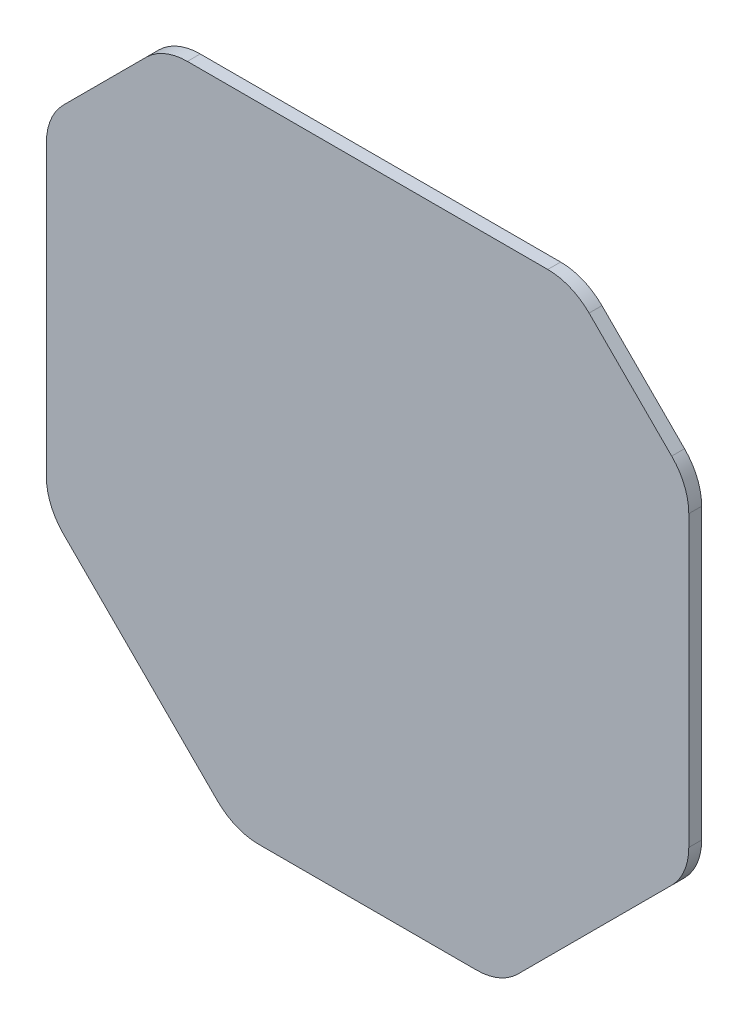
ISO-10303-21;
HEADER;
FILE_DESCRIPTION(('STEP AP214'),'2;1');
FILE_NAME('part.step','',(''),(''),'','','');
FILE_SCHEMA(('AUTOMOTIVE_DESIGN { 1 0 10303 214 1 1 1 1 }'));
ENDSEC;
DATA;
#1=APPLICATION_CONTEXT('core data for automotive mechanical design processes');
#2=APPLICATION_PROTOCOL_DEFINITION('international standard','automotive_design',2000,#1);
#3=PRODUCT_CONTEXT('',#1,'mechanical');
#4=PRODUCT('Part','Part','',(#3));
#5=PRODUCT_RELATED_PRODUCT_CATEGORY('part','',(#4));
#6=PRODUCT_DEFINITION_FORMATION('','',#4);
#7=PRODUCT_DEFINITION_CONTEXT('part definition',#1,'design');
#8=PRODUCT_DEFINITION('design','',#6,#7);
#9=PRODUCT_DEFINITION_SHAPE('','',#8);
#10=(LENGTH_UNIT() NAMED_UNIT(*) SI_UNIT(.MILLI.,.METRE.));
#11=(NAMED_UNIT(*) PLANE_ANGLE_UNIT() SI_UNIT($,.RADIAN.));
#12=(NAMED_UNIT(*) SI_UNIT($,.STERADIAN.) SOLID_ANGLE_UNIT());
#13=UNCERTAINTY_MEASURE_WITH_UNIT(LENGTH_MEASURE(1.E-05),#10,'distance_accuracy_value','');
#14=(GEOMETRIC_REPRESENTATION_CONTEXT(3) GLOBAL_UNCERTAINTY_ASSIGNED_CONTEXT((#13)) GLOBAL_UNIT_ASSIGNED_CONTEXT((#10,
#11,#12)) REPRESENTATION_CONTEXT('',''));
#15=CARTESIAN_POINT('',(0.,0.,0.));
#16=DIRECTION('',(0.,0.,1.));
#17=DIRECTION('',(1.,0.,0.));
#18=AXIS2_PLACEMENT_3D('',#15,#16,#17);
#19=CARTESIAN_POINT('',(114.3,-47.3446101792446,5.588));
#20=DIRECTION('',(0.,0.,-1.));
#21=DIRECTION('',(-1.,0.,0.));
#22=AXIS2_PLACEMENT_3D('',#19,#20,#21);
#23=CYLINDRICAL_SURFACE('',#22,25.4);
#24=CARTESIAN_POINT('',(114.3,-47.3446101792446,0.));
#25=DIRECTION('',(0.,0.,1.));
#26=DIRECTION('',(-1.,0.,0.));
#27=AXIS2_PLACEMENT_3D('',#24,#25,#26);
#28=CIRCLE('',#27,25.4);
#29=CARTESIAN_POINT('',(132.260512242138,-65.3051224213828,0.));
#30=VERTEX_POINT('',#29);
#31=CARTESIAN_POINT('',(139.7,-47.3446101792445,0.));
#32=VERTEX_POINT('',#31);
#33=EDGE_CURVE('E177',#30,#32,#28,.T.);
#34=ORIENTED_EDGE('',*,*,#33,.T.);
#35=DIRECTION('',(0.,0.,-1.));
#36=VECTOR('',#35,1.);
#37=CARTESIAN_POINT('',(139.7,-47.3446101792445,5.588));
#38=LINE('',#37,#36);
#39=CARTESIAN_POINT('',(139.7,-47.3446101792445,5.588));
#40=VERTEX_POINT('',#39);
#41=EDGE_CURVE('E11',#40,#32,#38,.T.);
#42=ORIENTED_EDGE('',*,*,#41,.F.);
#43=CARTESIAN_POINT('',(114.3,-47.3446101792446,5.588));
#44=DIRECTION('',(0.,0.,1.));
#45=DIRECTION('',(-1.,0.,0.));
#46=AXIS2_PLACEMENT_3D('',#43,#44,#45);
#47=CIRCLE('',#46,25.4);
#48=CARTESIAN_POINT('',(132.260512242138,-65.3051224213828,5.588));
#49=VERTEX_POINT('',#48);
#50=EDGE_CURVE('E207',#49,#40,#47,.T.);
#51=ORIENTED_EDGE('',*,*,#50,.F.);
#52=DIRECTION('',(0.,0.,-1.));
#53=VECTOR('',#52,1.);
#54=CARTESIAN_POINT('',(132.260512242138,-65.3051224213828,5.588));
#55=LINE('',#54,#53);
#56=EDGE_CURVE('E173',#49,#30,#55,.T.);
#57=ORIENTED_EDGE('',*,*,#56,.T.);
#58=EDGE_LOOP('',(#34,#42,#51,#57));
#59=FACE_BOUND('',#58,.T.);
#60=ADVANCED_FACE('F33',(#59),#23,.T.);
#61=CARTESIAN_POINT('',(139.7,78.3789755157245,5.588));
#62=DIRECTION('',(-1.,0.,0.));
#63=DIRECTION('',(0.,-1.,0.));
#64=AXIS2_PLACEMENT_3D('',#61,#62,#63);
#65=PLANE('',#64);
#66=DIRECTION('',(0.,1.,0.));
#67=VECTOR('',#66,1.);
#68=CARTESIAN_POINT('',(139.7,78.3789755157245,0.));
#69=LINE('',#68,#67);
#70=CARTESIAN_POINT('',(139.7,78.3789755157245,0.));
#71=VERTEX_POINT('',#70);
#72=EDGE_CURVE('E180',#32,#71,#69,.T.);
#73=ORIENTED_EDGE('',*,*,#72,.T.);
#74=DIRECTION('',(0.,0.,-1.));
#75=VECTOR('',#74,1.);
#76=CARTESIAN_POINT('',(139.7,78.3789755157245,5.588));
#77=LINE('',#76,#75);
#78=CARTESIAN_POINT('',(139.7,78.3789755157245,5.588));
#79=VERTEX_POINT('',#78);
#80=EDGE_CURVE('E41',#79,#71,#77,.T.);
#81=ORIENTED_EDGE('',*,*,#80,.F.);
#82=DIRECTION('',(0.,1.,0.));
#83=VECTOR('',#82,1.);
#84=CARTESIAN_POINT('',(139.7,78.3789755157245,5.588));
#85=LINE('',#84,#83);
#86=EDGE_CURVE('E116',#40,#79,#85,.T.);
#87=ORIENTED_EDGE('',*,*,#86,.F.);
#88=ORIENTED_EDGE('',*,*,#41,.T.);
#89=EDGE_LOOP('',(#73,#81,#87,#88));
#90=FACE_BOUND('',#89,.T.);
#91=ADVANCED_FACE('F305',(#90),#65,.F.);
#92=CARTESIAN_POINT('',(114.3,78.3789755157245,5.588));
#93=DIRECTION('',(0.,0.,-1.));
#94=DIRECTION('',(-1.,0.,0.));
#95=AXIS2_PLACEMENT_3D('',#92,#93,#94);
#96=CYLINDRICAL_SURFACE('',#95,25.4);
#97=CARTESIAN_POINT('',(114.3,78.3789755157245,0.));
#98=DIRECTION('',(0.,0.,1.));
#99=DIRECTION('',(1.,0.,0.));
#100=AXIS2_PLACEMENT_3D('',#97,#98,#99);
#101=CIRCLE('',#100,25.4);
#102=CARTESIAN_POINT('',(132.260512242138,96.3394877578631,0.));
#103=VERTEX_POINT('',#102);
#104=EDGE_CURVE('E182',#71,#103,#101,.T.);
#105=ORIENTED_EDGE('',*,*,#104,.T.);
#106=DIRECTION('',(0.,0.,-1.));
#107=VECTOR('',#106,1.);
#108=CARTESIAN_POINT('',(132.260512242138,96.3394877578631,5.588));
#109=LINE('',#108,#107);
#110=CARTESIAN_POINT('',(132.260512242138,96.3394877578631,5.588));
#111=VERTEX_POINT('',#110);
#112=EDGE_CURVE('E238',#111,#103,#109,.T.);
#113=ORIENTED_EDGE('',*,*,#112,.F.);
#114=CARTESIAN_POINT('',(114.3,78.3789755157245,5.588));
#115=DIRECTION('',(0.,0.,1.));
#116=DIRECTION('',(1.,0.,0.));
#117=AXIS2_PLACEMENT_3D('',#114,#115,#116);
#118=CIRCLE('',#117,25.4);
#119=EDGE_CURVE('E246',#79,#111,#118,.T.);
#120=ORIENTED_EDGE('',*,*,#119,.F.);
#121=ORIENTED_EDGE('',*,*,#80,.T.);
#122=EDGE_LOOP('',(#105,#113,#120,#121));
#123=FACE_BOUND('',#122,.T.);
#124=ADVANCED_FACE('F244',(#123),#96,.T.);
#125=CARTESIAN_POINT('',(96.3394877578616,132.260512242139,5.588));
#126=DIRECTION('',(-0.707106781186538,-0.707106781186557,0.));
#127=DIRECTION('',(0.707106781186557,-0.707106781186538,0.));
#128=AXIS2_PLACEMENT_3D('',#125,#126,#127);
#129=PLANE('',#128);
#130=DIRECTION('',(-0.707106781186557,0.707106781186538,0.));
#131=VECTOR('',#130,1.);
#132=CARTESIAN_POINT('',(96.3394877578616,132.260512242139,0.));
#133=LINE('',#132,#131);
#134=CARTESIAN_POINT('',(96.3394877578616,132.260512242139,0.));
#135=VERTEX_POINT('',#134);
#136=EDGE_CURVE('E184',#103,#135,#133,.T.);
#137=ORIENTED_EDGE('',*,*,#136,.T.);
#138=DIRECTION('',(0.,0.,-1.));
#139=VECTOR('',#138,1.);
#140=CARTESIAN_POINT('',(96.3394877578616,132.260512242139,5.588));
#141=LINE('',#140,#139);
#142=CARTESIAN_POINT('',(96.3394877578616,132.260512242139,5.588));
#143=VERTEX_POINT('',#142);
#144=EDGE_CURVE('E235',#143,#135,#141,.T.);
#145=ORIENTED_EDGE('',*,*,#144,.F.);
#146=DIRECTION('',(-0.707106781186557,0.707106781186538,0.));
#147=VECTOR('',#146,1.);
#148=CARTESIAN_POINT('',(96.3394877578616,132.260512242139,5.588));
#149=LINE('',#148,#147);
#150=EDGE_CURVE('E264',#111,#143,#149,.T.);
#151=ORIENTED_EDGE('',*,*,#150,.F.);
#152=ORIENTED_EDGE('',*,*,#112,.T.);
#153=EDGE_LOOP('',(#137,#145,#151,#152));
#154=FACE_BOUND('',#153,.T.);
#155=ADVANCED_FACE('F255',(#154),#129,.F.);
#156=CARTESIAN_POINT('',(78.3789755157236,114.3,5.588));
#157=DIRECTION('',(0.,0.,-1.));
#158=DIRECTION('',(-1.,0.,0.));
#159=AXIS2_PLACEMENT_3D('',#156,#157,#158);
#160=CYLINDRICAL_SURFACE('',#159,25.4);
#161=CARTESIAN_POINT('',(78.3789755157236,114.3,0.));
#162=DIRECTION('',(0.,0.,1.));
#163=DIRECTION('',(1.,0.,0.));
#164=AXIS2_PLACEMENT_3D('',#161,#162,#163);
#165=CIRCLE('',#164,25.4);
#166=CARTESIAN_POINT('',(78.3789755157236,139.7,0.));
#167=VERTEX_POINT('',#166);
#168=EDGE_CURVE('E186',#135,#167,#165,.T.);
#169=ORIENTED_EDGE('',*,*,#168,.T.);
#170=DIRECTION('',(0.,0.,-1.));
#171=VECTOR('',#170,1.);
#172=CARTESIAN_POINT('',(78.3789755157236,139.7,5.588));
#173=LINE('',#172,#171);
#174=CARTESIAN_POINT('',(78.3789755157236,139.7,5.588));
#175=VERTEX_POINT('',#174);
#176=EDGE_CURVE('E232',#175,#167,#173,.T.);
#177=ORIENTED_EDGE('',*,*,#176,.F.);
#178=CARTESIAN_POINT('',(78.3789755157236,114.3,5.588));
#179=DIRECTION('',(0.,0.,1.));
#180=DIRECTION('',(1.,0.,0.));
#181=AXIS2_PLACEMENT_3D('',#178,#179,#180);
#182=CIRCLE('',#181,25.4);
#183=EDGE_CURVE('E261',#143,#175,#182,.T.);
#184=ORIENTED_EDGE('',*,*,#183,.F.);
#185=ORIENTED_EDGE('',*,*,#144,.T.);
#186=EDGE_LOOP('',(#169,#177,#184,#185));
#187=FACE_BOUND('',#186,.T.);
#188=ADVANCED_FACE('F259',(#187),#160,.T.);
#189=CARTESIAN_POINT('',(78.3789755157236,139.7,5.588));
#190=DIRECTION('',(0.,-1.,0.));
#191=DIRECTION('',(1.,0.,0.));
#192=AXIS2_PLACEMENT_3D('',#189,#190,#191);
#193=PLANE('',#192);
#194=DIRECTION('',(-1.,0.,0.));
#195=VECTOR('',#194,1.);
#196=CARTESIAN_POINT('',(78.3789755157236,139.7,0.));
#197=LINE('',#196,#195);
#198=CARTESIAN_POINT('',(-78.3789755157232,139.7,0.));
#199=VERTEX_POINT('',#198);
#200=EDGE_CURVE('E188',#167,#199,#197,.T.);
#201=ORIENTED_EDGE('',*,*,#200,.T.);
#202=DIRECTION('',(0.,0.,-1.));
#203=VECTOR('',#202,1.);
#204=CARTESIAN_POINT('',(-78.3789755157232,139.7,5.588));
#205=LINE('',#204,#203);
#206=CARTESIAN_POINT('',(-78.3789755157232,139.7,5.588));
#207=VERTEX_POINT('',#206);
#208=EDGE_CURVE('E229',#207,#199,#205,.T.);
#209=ORIENTED_EDGE('',*,*,#208,.F.);
#210=DIRECTION('',(-1.,0.,0.));
#211=VECTOR('',#210,1.);
#212=CARTESIAN_POINT('',(78.3789755157236,139.7,5.588));
#213=LINE('',#212,#211);
#214=EDGE_CURVE('E263',#175,#207,#213,.T.);
#215=ORIENTED_EDGE('',*,*,#214,.F.);
#216=ORIENTED_EDGE('',*,*,#176,.T.);
#217=EDGE_LOOP('',(#201,#209,#215,#216));
#218=FACE_BOUND('',#217,.T.);
#219=ADVANCED_FACE('F318',(#218),#193,.F.);
#220=CARTESIAN_POINT('',(-78.3789755157232,114.3,5.588));
#221=DIRECTION('',(0.,0.,-1.));
#222=DIRECTION('',(-1.,0.,0.));
#223=AXIS2_PLACEMENT_3D('',#220,#221,#222);
#224=CYLINDRICAL_SURFACE('',#223,25.3999999999999);
#225=CARTESIAN_POINT('',(-78.3789755157232,114.3,0.));
#226=DIRECTION('',(0.,0.,1.));
#227=DIRECTION('',(-1.,0.,0.));
#228=AXIS2_PLACEMENT_3D('',#225,#226,#227);
#229=CIRCLE('',#228,25.3999999999999);
#230=CARTESIAN_POINT('',(-96.3394877578616,132.260512242138,0.));
#231=VERTEX_POINT('',#230);
#232=EDGE_CURVE('E190',#199,#231,#229,.T.);
#233=ORIENTED_EDGE('',*,*,#232,.T.);
#234=DIRECTION('',(0.,0.,-1.));
#235=VECTOR('',#234,1.);
#236=CARTESIAN_POINT('',(-96.3394877578616,132.260512242138,5.588));
#237=LINE('',#236,#235);
#238=CARTESIAN_POINT('',(-96.3394877578616,132.260512242138,5.588));
#239=VERTEX_POINT('',#238);
#240=EDGE_CURVE('E226',#239,#231,#237,.T.);
#241=ORIENTED_EDGE('',*,*,#240,.F.);
#242=CARTESIAN_POINT('',(-78.3789755157232,114.3,5.588));
#243=DIRECTION('',(0.,0.,1.));
#244=DIRECTION('',(-1.,0.,0.));
#245=AXIS2_PLACEMENT_3D('',#242,#243,#244);
#246=CIRCLE('',#245,25.3999999999999);
#247=EDGE_CURVE('E266',#207,#239,#246,.T.);
#248=ORIENTED_EDGE('',*,*,#247,.F.);
#249=ORIENTED_EDGE('',*,*,#208,.T.);
#250=EDGE_LOOP('',(#233,#241,#248,#249));
#251=FACE_BOUND('',#250,.T.);
#252=ADVANCED_FACE('F321',(#251),#224,.T.);
#253=CARTESIAN_POINT('',(-96.3394877578616,132.260512242138,5.588));
#254=DIRECTION('',(0.707106781186553,-0.707106781186542,0.));
#255=DIRECTION('',(0.707106781186542,0.707106781186553,0.));
#256=AXIS2_PLACEMENT_3D('',#253,#254,#255);
#257=PLANE('',#256);
#258=DIRECTION('',(-0.707106781186543,-0.707106781186553,0.));
#259=VECTOR('',#258,1.);
#260=CARTESIAN_POINT('',(-96.3394877578616,132.260512242138,0.));
#261=LINE('',#260,#259);
#262=CARTESIAN_POINT('',(-132.260512242138,96.3394877578608,0.));
#263=VERTEX_POINT('',#262);
#264=EDGE_CURVE('E192',#231,#263,#261,.T.);
#265=ORIENTED_EDGE('',*,*,#264,.T.);
#266=DIRECTION('',(0.,0.,-1.));
#267=VECTOR('',#266,1.);
#268=CARTESIAN_POINT('',(-132.260512242138,96.3394877578608,5.588));
#269=LINE('',#268,#267);
#270=CARTESIAN_POINT('',(-132.260512242138,96.3394877578608,5.588));
#271=VERTEX_POINT('',#270);
#272=EDGE_CURVE('E223',#271,#263,#269,.T.);
#273=ORIENTED_EDGE('',*,*,#272,.F.);
#274=DIRECTION('',(-0.707106781186543,-0.707106781186553,0.));
#275=VECTOR('',#274,1.);
#276=CARTESIAN_POINT('',(-96.3394877578616,132.260512242138,5.588));
#277=LINE('',#276,#275);
#278=EDGE_CURVE('E272',#239,#271,#277,.T.);
#279=ORIENTED_EDGE('',*,*,#278,.F.);
#280=ORIENTED_EDGE('',*,*,#240,.T.);
#281=EDGE_LOOP('',(#265,#273,#279,#280));
#282=FACE_BOUND('',#281,.T.);
#283=ADVANCED_FACE('F325',(#282),#257,.F.);
#284=CARTESIAN_POINT('',(-114.3,78.3789755157227,5.588));
#285=DIRECTION('',(0.,0.,-1.));
#286=DIRECTION('',(-1.,0.,0.));
#287=AXIS2_PLACEMENT_3D('',#284,#285,#286);
#288=CYLINDRICAL_SURFACE('',#287,25.4);
#289=CARTESIAN_POINT('',(-114.3,78.3789755157227,0.));
#290=DIRECTION('',(0.,0.,1.));
#291=DIRECTION('',(1.,0.,0.));
#292=AXIS2_PLACEMENT_3D('',#289,#290,#291);
#293=CIRCLE('',#292,25.4);
#294=CARTESIAN_POINT('',(-139.7,78.3789755157226,0.));
#295=VERTEX_POINT('',#294);
#296=EDGE_CURVE('E194',#263,#295,#293,.T.);
#297=ORIENTED_EDGE('',*,*,#296,.T.);
#298=DIRECTION('',(0.,0.,-1.));
#299=VECTOR('',#298,1.);
#300=CARTESIAN_POINT('',(-139.7,78.3789755157226,5.588));
#301=LINE('',#300,#299);
#302=CARTESIAN_POINT('',(-139.7,78.3789755157226,5.588));
#303=VERTEX_POINT('',#302);
#304=EDGE_CURVE('E220',#303,#295,#301,.T.);
#305=ORIENTED_EDGE('',*,*,#304,.F.);
#306=CARTESIAN_POINT('',(-114.3,78.3789755157227,5.588));
#307=DIRECTION('',(0.,0.,1.));
#308=DIRECTION('',(1.,0.,0.));
#309=AXIS2_PLACEMENT_3D('',#306,#307,#308);
#310=CIRCLE('',#309,25.4);
#311=EDGE_CURVE('E274',#271,#303,#310,.T.);
#312=ORIENTED_EDGE('',*,*,#311,.F.);
#313=ORIENTED_EDGE('',*,*,#272,.T.);
#314=EDGE_LOOP('',(#297,#305,#312,#313));
#315=FACE_BOUND('',#314,.T.);
#316=ADVANCED_FACE('F329',(#315),#288,.T.);
#317=CARTESIAN_POINT('',(-139.7,78.3789755157226,5.588));
#318=DIRECTION('',(1.,0.,0.));
#319=DIRECTION('',(0.,1.,0.));
#320=AXIS2_PLACEMENT_3D('',#317,#318,#319);
#321=PLANE('',#320);
#322=DIRECTION('',(0.,-1.,0.));
#323=VECTOR('',#322,1.);
#324=CARTESIAN_POINT('',(-139.7,78.3789755157226,0.));
#325=LINE('',#324,#323);
#326=CARTESIAN_POINT('',(-139.7,-47.3446101792447,0.));
#327=VERTEX_POINT('',#326);
#328=EDGE_CURVE('E196',#295,#327,#325,.T.);
#329=ORIENTED_EDGE('',*,*,#328,.T.);
#330=DIRECTION('',(0.,0.,-1.));
#331=VECTOR('',#330,1.);
#332=CARTESIAN_POINT('',(-139.7,-47.3446101792447,5.588));
#333=LINE('',#332,#331);
#334=CARTESIAN_POINT('',(-139.7,-47.3446101792447,5.588));
#335=VERTEX_POINT('',#334);
#336=EDGE_CURVE('E217',#335,#327,#333,.T.);
#337=ORIENTED_EDGE('',*,*,#336,.F.);
#338=DIRECTION('',(0.,-1.,0.));
#339=VECTOR('',#338,1.);
#340=CARTESIAN_POINT('',(-139.7,78.3789755157226,5.588));
#341=LINE('',#340,#339);
#342=EDGE_CURVE('E276',#303,#335,#341,.T.);
#343=ORIENTED_EDGE('',*,*,#342,.F.);
#344=ORIENTED_EDGE('',*,*,#304,.T.);
#345=EDGE_LOOP('',(#329,#337,#343,#344));
#346=FACE_BOUND('',#345,.T.);
#347=ADVANCED_FACE('F333',(#346),#321,.F.);
#348=CARTESIAN_POINT('',(-114.3,-47.3446101792447,5.588));
#349=DIRECTION('',(0.,0.,-1.));
#350=DIRECTION('',(-1.,0.,0.));
#351=AXIS2_PLACEMENT_3D('',#348,#349,#350);
#352=CYLINDRICAL_SURFACE('',#351,25.4);
#353=CARTESIAN_POINT('',(-114.3,-47.3446101792447,0.));
#354=DIRECTION('',(0.,0.,1.));
#355=DIRECTION('',(1.,0.,0.));
#356=AXIS2_PLACEMENT_3D('',#353,#354,#355);
#357=CIRCLE('',#356,25.4);
#358=CARTESIAN_POINT('',(-132.260512242138,-65.305122421383,0.));
#359=VERTEX_POINT('',#358);
#360=EDGE_CURVE('E198',#327,#359,#357,.T.);
#361=ORIENTED_EDGE('',*,*,#360,.T.);
#362=DIRECTION('',(0.,0.,-1.));
#363=VECTOR('',#362,1.);
#364=CARTESIAN_POINT('',(-132.260512242138,-65.305122421383,5.588));
#365=LINE('',#364,#363);
#366=CARTESIAN_POINT('',(-132.260512242138,-65.305122421383,5.588));
#367=VERTEX_POINT('',#366);
#368=EDGE_CURVE('E214',#367,#359,#365,.T.);
#369=ORIENTED_EDGE('',*,*,#368,.F.);
#370=CARTESIAN_POINT('',(-114.3,-47.3446101792447,5.588));
#371=DIRECTION('',(0.,0.,1.));
#372=DIRECTION('',(1.,0.,0.));
#373=AXIS2_PLACEMENT_3D('',#370,#371,#372);
#374=CIRCLE('',#373,25.4);
#375=EDGE_CURVE('E278',#335,#367,#374,.T.);
#376=ORIENTED_EDGE('',*,*,#375,.F.);
#377=ORIENTED_EDGE('',*,*,#336,.T.);
#378=EDGE_LOOP('',(#361,#369,#376,#377));
#379=FACE_BOUND('',#378,.T.);
#380=ADVANCED_FACE('F337',(#379),#352,.T.);
#381=CARTESIAN_POINT('',(-132.260512242138,-65.305122421383,5.588));
#382=DIRECTION('',(0.707106781186547,0.707106781186548,0.));
#383=DIRECTION('',(-0.707106781186548,0.707106781186547,0.));
#384=AXIS2_PLACEMENT_3D('',#381,#382,#383);
#385=PLANE('',#384);
#386=DIRECTION('',(0.707106781186548,-0.707106781186547,0.));
#387=VECTOR('',#386,1.);
#388=CARTESIAN_POINT('',(-132.260512242138,-65.305122421383,0.));
#389=LINE('',#388,#387);
#390=CARTESIAN_POINT('',(-65.305122421383,-132.260512242138,0.));
#391=VERTEX_POINT('',#390);
#392=EDGE_CURVE('E200',#359,#391,#389,.T.);
#393=ORIENTED_EDGE('',*,*,#392,.T.);
#394=DIRECTION('',(0.,0.,-1.));
#395=VECTOR('',#394,1.);
#396=CARTESIAN_POINT('',(-65.305122421383,-132.260512242138,5.588));
#397=LINE('',#396,#395);
#398=CARTESIAN_POINT('',(-65.305122421383,-132.260512242138,5.588));
#399=VERTEX_POINT('',#398);
#400=EDGE_CURVE('E211',#399,#391,#397,.T.);
#401=ORIENTED_EDGE('',*,*,#400,.F.);
#402=DIRECTION('',(0.707106781186548,-0.707106781186547,0.));
#403=VECTOR('',#402,1.);
#404=CARTESIAN_POINT('',(-132.260512242138,-65.305122421383,5.588));
#405=LINE('',#404,#403);
#406=EDGE_CURVE('E280',#367,#399,#405,.T.);
#407=ORIENTED_EDGE('',*,*,#406,.F.);
#408=ORIENTED_EDGE('',*,*,#368,.T.);
#409=EDGE_LOOP('',(#393,#401,#407,#408));
#410=FACE_BOUND('',#409,.T.);
#411=ADVANCED_FACE('F286',(#410),#385,.F.);
#412=CARTESIAN_POINT('',(-47.3446101792447,-114.3,5.588));
#413=DIRECTION('',(0.,0.,-1.));
#414=DIRECTION('',(-1.,0.,0.));
#415=AXIS2_PLACEMENT_3D('',#412,#413,#414);
#416=CYLINDRICAL_SURFACE('',#415,25.4);
#417=CARTESIAN_POINT('',(-47.3446101792447,-114.3,0.));
#418=DIRECTION('',(0.,0.,1.));
#419=DIRECTION('',(-1.,0.,0.));
#420=AXIS2_PLACEMENT_3D('',#417,#418,#419);
#421=CIRCLE('',#420,25.4);
#422=CARTESIAN_POINT('',(-47.3446101792447,-139.7,0.));
#423=VERTEX_POINT('',#422);
#424=EDGE_CURVE('E202',#391,#423,#421,.T.);
#425=ORIENTED_EDGE('',*,*,#424,.T.);
#426=DIRECTION('',(0.,0.,-1.));
#427=VECTOR('',#426,1.);
#428=CARTESIAN_POINT('',(-47.3446101792447,-139.7,5.588));
#429=LINE('',#428,#427);
#430=CARTESIAN_POINT('',(-47.3446101792447,-139.7,5.588));
#431=VERTEX_POINT('',#430);
#432=EDGE_CURVE('E168',#431,#423,#429,.T.);
#433=ORIENTED_EDGE('',*,*,#432,.F.);
#434=CARTESIAN_POINT('',(-47.3446101792447,-114.3,5.588));
#435=DIRECTION('',(0.,0.,1.));
#436=DIRECTION('',(-1.,0.,0.));
#437=AXIS2_PLACEMENT_3D('',#434,#435,#436);
#438=CIRCLE('',#437,25.4);
#439=EDGE_CURVE('E159',#399,#431,#438,.T.);
#440=ORIENTED_EDGE('',*,*,#439,.F.);
#441=ORIENTED_EDGE('',*,*,#400,.T.);
#442=EDGE_LOOP('',(#425,#433,#440,#441));
#443=FACE_BOUND('',#442,.T.);
#444=ADVANCED_FACE('F290',(#443),#416,.T.);
#445=CARTESIAN_POINT('',(-47.3446101792447,-139.7,5.588));
#446=DIRECTION('',(0.,1.,0.));
#447=DIRECTION('',(0.,0.,1.));
#448=AXIS2_PLACEMENT_3D('',#445,#446,#447);
#449=PLANE('',#448);
#450=DIRECTION('',(1.,0.,0.));
#451=VECTOR('',#450,1.);
#452=CARTESIAN_POINT('',(-47.3446101792447,-139.7,0.));
#453=LINE('',#452,#451);
#454=CARTESIAN_POINT('',(47.3446101792447,-139.7,0.));
#455=VERTEX_POINT('',#454);
#456=EDGE_CURVE('E167',#423,#455,#453,.T.);
#457=ORIENTED_EDGE('',*,*,#456,.T.);
#458=DIRECTION('',(0.,0.,-1.));
#459=VECTOR('',#458,1.);
#460=CARTESIAN_POINT('',(47.3446101792447,-139.7,5.588));
#461=LINE('',#460,#459);
#462=CARTESIAN_POINT('',(47.3446101792447,-139.7,5.588));
#463=VERTEX_POINT('',#462);
#464=EDGE_CURVE('E164',#463,#455,#461,.T.);
#465=ORIENTED_EDGE('',*,*,#464,.F.);
#466=DIRECTION('',(1.,0.,0.));
#467=VECTOR('',#466,1.);
#468=CARTESIAN_POINT('',(-47.3446101792447,-139.7,5.588));
#469=LINE('',#468,#467);
#470=EDGE_CURVE('E153',#431,#463,#469,.T.);
#471=ORIENTED_EDGE('',*,*,#470,.F.);
#472=ORIENTED_EDGE('',*,*,#432,.T.);
#473=EDGE_LOOP('',(#457,#465,#471,#472));
#474=FACE_BOUND('',#473,.T.);
#475=ADVANCED_FACE('F165',(#474),#449,.F.);
#476=CARTESIAN_POINT('',(47.3446101792447,-114.3,5.588));
#477=DIRECTION('',(0.,0.,-1.));
#478=DIRECTION('',(-1.,0.,0.));
#479=AXIS2_PLACEMENT_3D('',#476,#477,#478);
#480=CYLINDRICAL_SURFACE('',#479,25.4);
#481=CARTESIAN_POINT('',(47.3446101792447,-114.3,0.));
#482=DIRECTION('',(0.,0.,1.));
#483=DIRECTION('',(1.,0.,0.));
#484=AXIS2_PLACEMENT_3D('',#481,#482,#483);
#485=CIRCLE('',#484,25.4);
#486=CARTESIAN_POINT('',(65.305122421383,-132.260512242138,0.));
#487=VERTEX_POINT('',#486);
#488=EDGE_CURVE('E102',#455,#487,#485,.T.);
#489=ORIENTED_EDGE('',*,*,#488,.T.);
#490=DIRECTION('',(0.,0.,-1.));
#491=VECTOR('',#490,1.);
#492=CARTESIAN_POINT('',(65.305122421383,-132.260512242138,5.588));
#493=LINE('',#492,#491);
#494=CARTESIAN_POINT('',(65.305122421383,-132.260512242138,5.588));
#495=VERTEX_POINT('',#494);
#496=EDGE_CURVE('E169',#495,#487,#493,.T.);
#497=ORIENTED_EDGE('',*,*,#496,.F.);
#498=CARTESIAN_POINT('',(47.3446101792447,-114.3,5.588));
#499=DIRECTION('',(0.,0.,1.));
#500=DIRECTION('',(1.,0.,0.));
#501=AXIS2_PLACEMENT_3D('',#498,#499,#500);
#502=CIRCLE('',#501,25.4);
#503=EDGE_CURVE('E157',#463,#495,#502,.T.);
#504=ORIENTED_EDGE('',*,*,#503,.F.);
#505=ORIENTED_EDGE('',*,*,#464,.T.);
#506=EDGE_LOOP('',(#489,#497,#504,#505));
#507=FACE_BOUND('',#506,.T.);
#508=ADVANCED_FACE('F171',(#507),#480,.T.);
#509=CARTESIAN_POINT('',(65.305122421383,-132.260512242138,5.588));
#510=DIRECTION('',(-0.707106781186548,0.707106781186547,0.));
#511=DIRECTION('',(-0.707106781186547,-0.707106781186548,0.));
#512=AXIS2_PLACEMENT_3D('',#509,#510,#511);
#513=PLANE('',#512);
#514=DIRECTION('',(0.707106781186547,0.707106781186548,0.));
#515=VECTOR('',#514,1.);
#516=CARTESIAN_POINT('',(65.305122421383,-132.260512242138,0.));
#517=LINE('',#516,#515);
#518=EDGE_CURVE('E108',#487,#30,#517,.T.);
#519=ORIENTED_EDGE('',*,*,#518,.T.);
#520=ORIENTED_EDGE('',*,*,#56,.F.);
#521=DIRECTION('',(0.707106781186547,0.707106781186548,0.));
#522=VECTOR('',#521,1.);
#523=CARTESIAN_POINT('',(65.305122421383,-132.260512242138,5.588));
#524=LINE('',#523,#522);
#525=EDGE_CURVE('E49',#495,#49,#524,.T.);
#526=ORIENTED_EDGE('',*,*,#525,.F.);
#527=ORIENTED_EDGE('',*,*,#496,.T.);
#528=EDGE_LOOP('',(#519,#520,#526,#527));
#529=FACE_BOUND('',#528,.T.);
#530=ADVANCED_FACE('F294',(#529),#513,.F.);
#531=CARTESIAN_POINT('',(114.3,-47.3446101792446,5.588));
#532=DIRECTION('',(0.,0.,-1.));
#533=DIRECTION('',(-1.,0.,0.));
#534=AXIS2_PLACEMENT_3D('',#531,#532,#533);
#535=PLANE('',#534);
#536=ORIENTED_EDGE('',*,*,#50,.T.);
#537=ORIENTED_EDGE('',*,*,#86,.T.);
#538=ORIENTED_EDGE('',*,*,#119,.T.);
#539=ORIENTED_EDGE('',*,*,#150,.T.);
#540=ORIENTED_EDGE('',*,*,#183,.T.);
#541=ORIENTED_EDGE('',*,*,#214,.T.);
#542=ORIENTED_EDGE('',*,*,#247,.T.);
#543=ORIENTED_EDGE('',*,*,#278,.T.);
#544=ORIENTED_EDGE('',*,*,#311,.T.);
#545=ORIENTED_EDGE('',*,*,#342,.T.);
#546=ORIENTED_EDGE('',*,*,#375,.T.);
#547=ORIENTED_EDGE('',*,*,#406,.T.);
#548=ORIENTED_EDGE('',*,*,#439,.T.);
#549=ORIENTED_EDGE('',*,*,#470,.T.);
#550=ORIENTED_EDGE('',*,*,#503,.T.);
#551=ORIENTED_EDGE('',*,*,#525,.T.);
#552=EDGE_LOOP('',(#536,#537,#538,#539,#540,#541,#542,#543,#544,#545,#546,#547,#548,#549,#550,#551));
#553=FACE_BOUND('',#552,.T.);
#554=ADVANCED_FACE('F155',(#553),#535,.F.);
#555=CARTESIAN_POINT('',(114.3,-47.3446101792446,0.));
#556=DIRECTION('',(0.,0.,-1.));
#557=DIRECTION('',(-1.,0.,0.));
#558=AXIS2_PLACEMENT_3D('',#555,#556,#557);
#559=PLANE('',#558);
#560=ORIENTED_EDGE('',*,*,#33,.F.);
#561=ORIENTED_EDGE('',*,*,#518,.F.);
#562=ORIENTED_EDGE('',*,*,#488,.F.);
#563=ORIENTED_EDGE('',*,*,#456,.F.);
#564=ORIENTED_EDGE('',*,*,#424,.F.);
#565=ORIENTED_EDGE('',*,*,#392,.F.);
#566=ORIENTED_EDGE('',*,*,#360,.F.);
#567=ORIENTED_EDGE('',*,*,#328,.F.);
#568=ORIENTED_EDGE('',*,*,#296,.F.);
#569=ORIENTED_EDGE('',*,*,#264,.F.);
#570=ORIENTED_EDGE('',*,*,#232,.F.);
#571=ORIENTED_EDGE('',*,*,#200,.F.);
#572=ORIENTED_EDGE('',*,*,#168,.F.);
#573=ORIENTED_EDGE('',*,*,#136,.F.);
#574=ORIENTED_EDGE('',*,*,#104,.F.);
#575=ORIENTED_EDGE('',*,*,#72,.F.);
#576=EDGE_LOOP('',(#560,#561,#562,#563,#564,#565,#566,#567,#568,#569,#570,#571,#572,#573,#574,#575));
#577=FACE_BOUND('',#576,.T.);
#578=ADVANCED_FACE('F250',(#577),#559,.T.);
#579=CLOSED_SHELL('',(#60,#91,#124,#155,#188,#219,#252,#283,#316,#347,#380,#411,#444,#475,#508,
#530,#554,#578));
#580=MANIFOLD_SOLID_BREP('B2',#579);
#581=ADVANCED_BREP_SHAPE_REPRESENTATION('',(#18,#580),#14);
#582=SHAPE_DEFINITION_REPRESENTATION(#9,#581);
ENDSEC;
END-ISO-10303-21;
